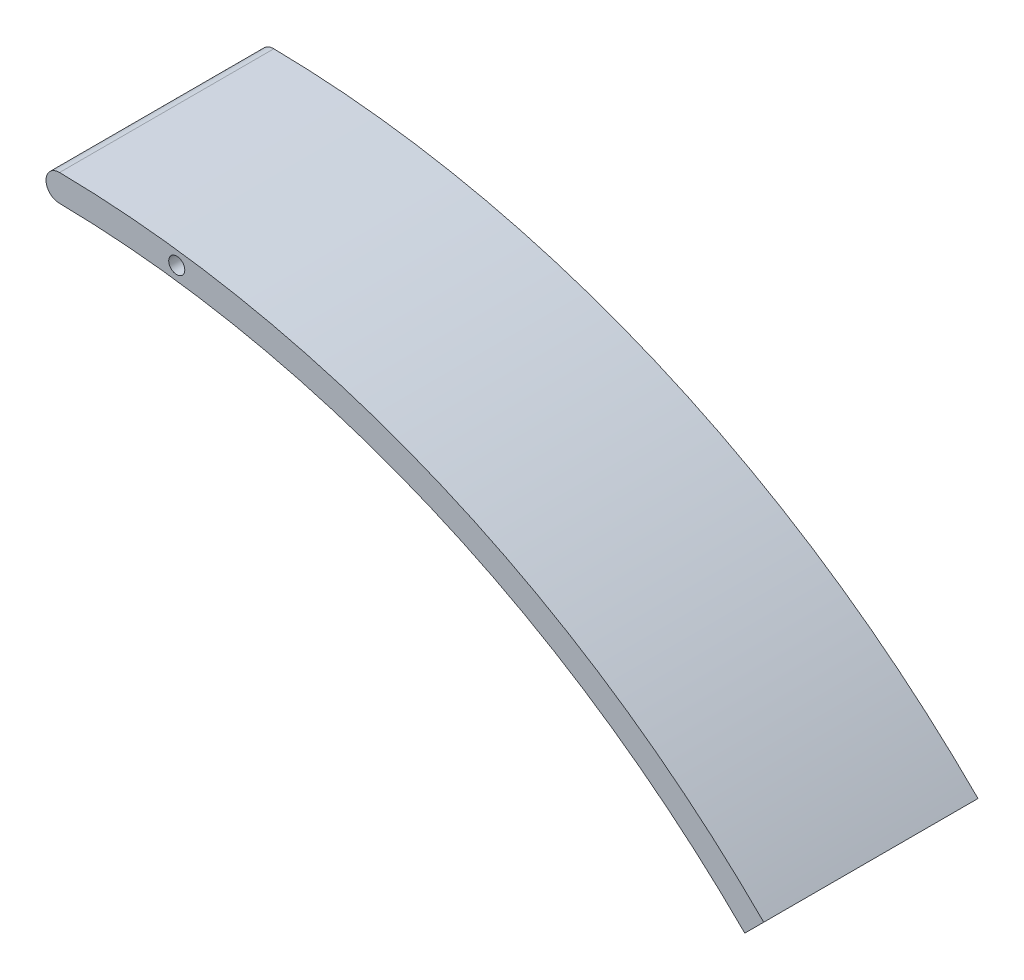
ISO-10303-21;
HEADER;
FILE_DESCRIPTION(('STEP AP214'),'2;1');
FILE_NAME('part.step','',(''),(''),'','','');
FILE_SCHEMA(('AUTOMOTIVE_DESIGN { 1 0 10303 214 1 1 1 1 }'));
ENDSEC;
DATA;
#1=APPLICATION_CONTEXT('core data for automotive mechanical design processes');
#2=APPLICATION_PROTOCOL_DEFINITION('international standard','automotive_design',2000,#1);
#3=PRODUCT_CONTEXT('',#1,'mechanical');
#4=PRODUCT('Part','Part','',(#3));
#5=PRODUCT_RELATED_PRODUCT_CATEGORY('part','',(#4));
#6=PRODUCT_DEFINITION_FORMATION('','',#4);
#7=PRODUCT_DEFINITION_CONTEXT('part definition',#1,'design');
#8=PRODUCT_DEFINITION('design','',#6,#7);
#9=PRODUCT_DEFINITION_SHAPE('','',#8);
#10=(LENGTH_UNIT() NAMED_UNIT(*) SI_UNIT(.MILLI.,.METRE.));
#11=(NAMED_UNIT(*) PLANE_ANGLE_UNIT() SI_UNIT($,.RADIAN.));
#12=(NAMED_UNIT(*) SI_UNIT($,.STERADIAN.) SOLID_ANGLE_UNIT());
#13=UNCERTAINTY_MEASURE_WITH_UNIT(LENGTH_MEASURE(1.E-05),#10,'distance_accuracy_value','');
#14=(GEOMETRIC_REPRESENTATION_CONTEXT(3) GLOBAL_UNCERTAINTY_ASSIGNED_CONTEXT((#13)) GLOBAL_UNIT_ASSIGNED_CONTEXT((#10,
#11,#12)) REPRESENTATION_CONTEXT('',''));
#15=CARTESIAN_POINT('',(0.,0.,0.));
#16=DIRECTION('',(0.,0.,1.));
#17=DIRECTION('',(1.,0.,0.));
#18=AXIS2_PLACEMENT_3D('',#15,#16,#17);
#19=CARTESIAN_POINT('',(0.,0.,80.));
#20=DIRECTION('',(0.,0.,-1.));
#21=DIRECTION('',(-1.,0.,0.));
#22=AXIS2_PLACEMENT_3D('',#19,#20,#21);
#23=CYLINDRICAL_SURFACE('',#22,379.);
#24=CARTESIAN_POINT('',(0.,0.,0.));
#25=DIRECTION('',(0.,0.,1.));
#26=DIRECTION('',(1.,0.,0.));
#27=AXIS2_PLACEMENT_3D('',#24,#25,#26);
#28=CIRCLE('',#27,379.);
#29=CARTESIAN_POINT('',(5.0668449197861,378.96612920228,0.));
#30=VERTEX_POINT('',#29);
#31=CARTESIAN_POINT('',(267.993470069702,267.993470069701,0.));
#32=VERTEX_POINT('',#31);
#33=EDGE_CURVE('E190',#30,#32,#28,.F.);
#34=ORIENTED_EDGE('',*,*,#33,.F.);
#35=DIRECTION('',(0.,0.,-1.));
#36=VECTOR('',#35,1.);
#37=CARTESIAN_POINT('',(5.0668449197861,378.96612920228,80.));
#38=LINE('',#37,#36);
#39=CARTESIAN_POINT('',(5.0668449197861,378.96612920228,80.));
#40=VERTEX_POINT('',#39);
#41=EDGE_CURVE('E11',#30,#40,#38,.F.);
#42=ORIENTED_EDGE('',*,*,#41,.T.);
#43=CARTESIAN_POINT('',(0.,0.,80.));
#44=DIRECTION('',(0.,0.,1.));
#45=DIRECTION('',(1.,0.,0.));
#46=AXIS2_PLACEMENT_3D('',#43,#44,#45);
#47=CIRCLE('',#46,379.);
#48=CARTESIAN_POINT('',(267.993470069702,267.993470069701,80.));
#49=VERTEX_POINT('',#48);
#50=EDGE_CURVE('E174',#40,#49,#47,.F.);
#51=ORIENTED_EDGE('',*,*,#50,.T.);
#52=DIRECTION('',(0.,0.,-1.));
#53=VECTOR('',#52,1.);
#54=CARTESIAN_POINT('',(267.993470069702,267.993470069701,80.));
#55=LINE('',#54,#53);
#56=EDGE_CURVE('E185',#49,#32,#55,.T.);
#57=ORIENTED_EDGE('',*,*,#56,.T.);
#58=EDGE_LOOP('',(#34,#42,#51,#57));
#59=FACE_BOUND('',#58,.T.);
#60=ADVANCED_FACE('F47',(#59),#23,.T.);
#61=CARTESIAN_POINT('',(0.,0.,80.));
#62=DIRECTION('',(0.,0.,-1.));
#63=DIRECTION('',(-1.,0.,0.));
#64=AXIS2_PLACEMENT_3D('',#61,#62,#63);
#65=CYLINDRICAL_SURFACE('',#64,369.);
#66=CARTESIAN_POINT('',(0.,0.,80.));
#67=DIRECTION('',(0.,0.,1.));
#68=DIRECTION('',(1.,0.,0.));
#69=AXIS2_PLACEMENT_3D('',#66,#67,#68);
#70=CIRCLE('',#69,369.);
#71=CARTESIAN_POINT('',(4.9331550802139,368.967022890874,80.));
#72=VERTEX_POINT('',#71);
#73=CARTESIAN_POINT('',(260.922402257837,260.922402257836,80.));
#74=VERTEX_POINT('',#73);
#75=EDGE_CURVE('E178',#72,#74,#70,.F.);
#76=ORIENTED_EDGE('',*,*,#75,.F.);
#77=DIRECTION('',(0.,0.,-1.));
#78=VECTOR('',#77,1.);
#79=CARTESIAN_POINT('',(4.9331550802139,368.967022890874,80.));
#80=LINE('',#79,#78);
#81=CARTESIAN_POINT('',(4.9331550802139,368.967022890874,0.));
#82=VERTEX_POINT('',#81);
#83=EDGE_CURVE('E208',#72,#82,#80,.T.);
#84=ORIENTED_EDGE('',*,*,#83,.T.);
#85=CARTESIAN_POINT('',(0.,0.,0.));
#86=DIRECTION('',(0.,0.,1.));
#87=DIRECTION('',(1.,0.,0.));
#88=AXIS2_PLACEMENT_3D('',#85,#86,#87);
#89=CIRCLE('',#88,369.);
#90=CARTESIAN_POINT('',(260.922402257837,260.922402257836,0.));
#91=VERTEX_POINT('',#90);
#92=EDGE_CURVE('E193',#82,#91,#89,.F.);
#93=ORIENTED_EDGE('',*,*,#92,.T.);
#94=DIRECTION('',(0.,0.,-1.));
#95=VECTOR('',#94,1.);
#96=CARTESIAN_POINT('',(260.922402257837,260.922402257836,80.));
#97=LINE('',#96,#95);
#98=CARTESIAN_POINT('',(260.922402257837,260.922402257835,20.));
#99=VERTEX_POINT('',#98);
#100=EDGE_CURVE('E203',#99,#91,#97,.T.);
#101=ORIENTED_EDGE('',*,*,#100,.F.);
#102=DIRECTION('',(0.,0.,-1.));
#103=VECTOR('',#102,1.);
#104=CARTESIAN_POINT('',(260.922402257837,260.922402257835,60.));
#105=LINE('',#104,#103);
#106=CARTESIAN_POINT('',(260.922402257837,260.922402257836,60.));
#107=VERTEX_POINT('',#106);
#108=EDGE_CURVE('E156',#107,#99,#105,.T.);
#109=ORIENTED_EDGE('',*,*,#108,.F.);
#110=EDGE_CURVE('E204',#74,#107,#97,.T.);
#111=ORIENTED_EDGE('',*,*,#110,.F.);
#112=EDGE_LOOP('',(#76,#84,#93,#101,#109,#111));
#113=FACE_BOUND('',#112,.T.);
#114=ADVANCED_FACE('F230',(#113),#65,.F.);
#115=CARTESIAN_POINT('',(48.8167958902993,370.800378153805,80.));
#116=DIRECTION('',(0.,0.,-1.));
#117=DIRECTION('',(-1.,0.,0.));
#118=AXIS2_PLACEMENT_3D('',#115,#116,#117);
#119=CYLINDRICAL_SURFACE('',#118,3.);
#120=CARTESIAN_POINT('',(48.8167958902993,370.800378153805,80.));
#121=DIRECTION('',(0.,0.,1.));
#122=DIRECTION('',(1.,0.,0.));
#123=AXIS2_PLACEMENT_3D('',#120,#121,#122);
#124=CIRCLE('',#123,3.);
#125=CARTESIAN_POINT('',(51.8167958902993,370.800378153805,80.));
#126=VERTEX_POINT('',#125);
#127=EDGE_CURVE('E170',#126,#126,#124,.T.);
#128=ORIENTED_EDGE('',*,*,#127,.T.);
#129=EDGE_LOOP('',(#128));
#130=FACE_BOUND('',#129,.T.);
#131=CARTESIAN_POINT('',(48.8167958902993,370.800378153805,0.));
#132=DIRECTION('',(0.,0.,1.));
#133=DIRECTION('',(1.,0.,0.));
#134=AXIS2_PLACEMENT_3D('',#131,#132,#133);
#135=CIRCLE('',#134,3.);
#136=CARTESIAN_POINT('',(51.8167958902993,370.800378153805,0.));
#137=VERTEX_POINT('',#136);
#138=EDGE_CURVE('E186',#137,#137,#135,.T.);
#139=ORIENTED_EDGE('',*,*,#138,.F.);
#140=EDGE_LOOP('',(#139));
#141=FACE_BOUND('',#140,.T.);
#142=ADVANCED_FACE('F267',(#130,#141),#119,.F.);
#143=CARTESIAN_POINT('',(-6.28036983473508E-13,6.28036983473513E-13,80.));
#144=DIRECTION('',(0.707106781186545,-0.70710678118655,0.));
#145=DIRECTION('',(0.70710678118655,0.707106781186545,0.));
#146=AXIS2_PLACEMENT_3D('',#143,#144,#145);
#147=PLANE('',#146);
#148=DIRECTION('',(-0.707106781186554,-0.707106781186541,0.));
#149=VECTOR('',#148,1.);
#150=CARTESIAN_POINT('',(260.922402257837,260.922402257835,60.));
#151=LINE('',#150,#149);
#152=CARTESIAN_POINT('',(263.750829382583,263.750829382581,60.));
#153=VERTEX_POINT('',#152);
#154=EDGE_CURVE('E64',#153,#107,#151,.T.);
#155=ORIENTED_EDGE('',*,*,#154,.F.);
#156=DIRECTION('',(0.,0.,1.));
#157=VECTOR('',#156,1.);
#158=CARTESIAN_POINT('',(263.750829382583,263.750829382581,60.));
#159=LINE('',#158,#157);
#160=CARTESIAN_POINT('',(263.750829382583,263.750829382581,20.));
#161=VERTEX_POINT('',#160);
#162=EDGE_CURVE('E143',#161,#153,#159,.T.);
#163=ORIENTED_EDGE('',*,*,#162,.F.);
#164=DIRECTION('',(0.707106781186554,0.707106781186541,0.));
#165=VECTOR('',#164,1.);
#166=CARTESIAN_POINT('',(260.922402257837,260.922402257835,20.));
#167=LINE('',#166,#165);
#168=EDGE_CURVE('E147',#99,#161,#167,.T.);
#169=ORIENTED_EDGE('',*,*,#168,.F.);
#170=ORIENTED_EDGE('',*,*,#100,.T.);
#171=DIRECTION('',(-0.70710678118655,-0.707106781186545,0.));
#172=VECTOR('',#171,1.);
#173=CARTESIAN_POINT('',(-6.28036983473508E-13,6.28036983473513E-13,0.));
#174=LINE('',#173,#172);
#175=EDGE_CURVE('E175',#32,#91,#174,.T.);
#176=ORIENTED_EDGE('',*,*,#175,.F.);
#177=ORIENTED_EDGE('',*,*,#56,.F.);
#178=DIRECTION('',(-0.70710678118655,-0.707106781186545,0.));
#179=VECTOR('',#178,1.);
#180=CARTESIAN_POINT('',(-6.28036983473508E-13,6.28036983473513E-13,80.));
#181=LINE('',#180,#179);
#182=EDGE_CURVE('E181',#49,#74,#181,.T.);
#183=ORIENTED_EDGE('',*,*,#182,.T.);
#184=ORIENTED_EDGE('',*,*,#110,.T.);
#185=EDGE_LOOP('',(#155,#163,#169,#170,#176,#177,#183,#184));
#186=FACE_BOUND('',#185,.T.);
#187=ADVANCED_FACE('F242',(#186),#147,.T.);
#188=CARTESIAN_POINT('',(0.,0.,80.));
#189=DIRECTION('',(0.,0.,1.));
#190=DIRECTION('',(1.,0.,0.));
#191=AXIS2_PLACEMENT_3D('',#188,#189,#190);
#192=PLANE('',#191);
#193=ORIENTED_EDGE('',*,*,#127,.F.);
#194=EDGE_LOOP('',(#193));
#195=FACE_BOUND('',#194,.T.);
#196=CARTESIAN_POINT('',(5.,373.966576046577,80.));
#197=DIRECTION('',(0.,0.,1.));
#198=DIRECTION('',(1.,0.,0.));
#199=AXIS2_PLACEMENT_3D('',#196,#197,#198);
#200=CIRCLE('',#199,5.);
#201=CARTESIAN_POINT('',(0.,373.966576046577,80.));
#202=VERTEX_POINT('',#201);
#203=EDGE_CURVE('E72',#40,#202,#200,.T.);
#204=ORIENTED_EDGE('',*,*,#203,.T.);
#205=CARTESIAN_POINT('',(5.,373.966576046577,80.));
#206=DIRECTION('',(0.,0.,1.));
#207=DIRECTION('',(1.,0.,0.));
#208=AXIS2_PLACEMENT_3D('',#205,#206,#207);
#209=CIRCLE('',#208,5.);
#210=EDGE_CURVE('E57',#202,#72,#209,.T.);
#211=ORIENTED_EDGE('',*,*,#210,.T.);
#212=ORIENTED_EDGE('',*,*,#75,.T.);
#213=ORIENTED_EDGE('',*,*,#182,.F.);
#214=ORIENTED_EDGE('',*,*,#50,.F.);
#215=EDGE_LOOP('',(#204,#211,#212,#213,#214));
#216=FACE_BOUND('',#215,.T.);
#217=ADVANCED_FACE('F223',(#195,#216),#192,.T.);
#218=CARTESIAN_POINT('',(0.,0.,0.));
#219=DIRECTION('',(0.,0.,1.));
#220=DIRECTION('',(1.,0.,0.));
#221=AXIS2_PLACEMENT_3D('',#218,#219,#220);
#222=PLANE('',#221);
#223=ORIENTED_EDGE('',*,*,#138,.T.);
#224=EDGE_LOOP('',(#223));
#225=FACE_BOUND('',#224,.T.);
#226=ORIENTED_EDGE('',*,*,#92,.F.);
#227=CARTESIAN_POINT('',(5.,373.966576046577,0.));
#228=DIRECTION('',(0.,0.,1.));
#229=DIRECTION('',(1.,0.,0.));
#230=AXIS2_PLACEMENT_3D('',#227,#228,#229);
#231=CIRCLE('',#230,5.);
#232=CARTESIAN_POINT('',(0.,373.966576046577,0.));
#233=VERTEX_POINT('',#232);
#234=EDGE_CURVE('E215',#82,#233,#231,.F.);
#235=ORIENTED_EDGE('',*,*,#234,.T.);
#236=CARTESIAN_POINT('',(5.,373.966576046577,0.));
#237=DIRECTION('',(0.,0.,1.));
#238=DIRECTION('',(1.,0.,0.));
#239=AXIS2_PLACEMENT_3D('',#236,#237,#238);
#240=CIRCLE('',#239,5.);
#241=EDGE_CURVE('E212',#233,#30,#240,.F.);
#242=ORIENTED_EDGE('',*,*,#241,.T.);
#243=ORIENTED_EDGE('',*,*,#33,.T.);
#244=ORIENTED_EDGE('',*,*,#175,.T.);
#245=EDGE_LOOP('',(#226,#235,#242,#243,#244));
#246=FACE_BOUND('',#245,.T.);
#247=ADVANCED_FACE('F235',(#225,#246),#222,.F.);
#248=CARTESIAN_POINT('',(5.,373.966576046577,80.));
#249=DIRECTION('',(0.,0.,-1.));
#250=DIRECTION('',(-1.,0.,0.));
#251=AXIS2_PLACEMENT_3D('',#248,#249,#250);
#252=CYLINDRICAL_SURFACE('',#251,5.);
#253=DIRECTION('',(0.,0.,1.));
#254=VECTOR('',#253,1.);
#255=CARTESIAN_POINT('',(0.,373.966576046577,0.));
#256=LINE('',#255,#254);
#257=EDGE_CURVE('E51',#202,#233,#256,.F.);
#258=ORIENTED_EDGE('',*,*,#257,.F.);
#259=ORIENTED_EDGE('',*,*,#203,.F.);
#260=ORIENTED_EDGE('',*,*,#41,.F.);
#261=ORIENTED_EDGE('',*,*,#241,.F.);
#262=EDGE_LOOP('',(#258,#259,#260,#261));
#263=FACE_BOUND('',#262,.T.);
#264=ADVANCED_FACE('F49',(#263),#252,.T.);
#265=CARTESIAN_POINT('',(5.,373.966576046577,80.));
#266=DIRECTION('',(0.,0.,-1.));
#267=DIRECTION('',(-1.,0.,0.));
#268=AXIS2_PLACEMENT_3D('',#265,#266,#267);
#269=CYLINDRICAL_SURFACE('',#268,5.);
#270=ORIENTED_EDGE('',*,*,#210,.F.);
#271=ORIENTED_EDGE('',*,*,#257,.T.);
#272=ORIENTED_EDGE('',*,*,#234,.F.);
#273=ORIENTED_EDGE('',*,*,#83,.F.);
#274=EDGE_LOOP('',(#270,#271,#272,#273));
#275=FACE_BOUND('',#274,.T.);
#276=ADVANCED_FACE('F232',(#275),#269,.T.);
#277=CARTESIAN_POINT('',(253.851334445972,267.9934700697,60.));
#278=DIRECTION('',(0.,0.,1.));
#279=DIRECTION('',(1.,0.,0.));
#280=AXIS2_PLACEMENT_3D('',#277,#278,#279);
#281=PLANE('',#280);
#282=ORIENTED_EDGE('',*,*,#154,.T.);
#283=DIRECTION('',(0.707106781186545,-0.70710678118655,0.));
#284=VECTOR('',#283,1.);
#285=CARTESIAN_POINT('',(253.851334445972,267.9934700697,60.));
#286=LINE('',#285,#284);
#287=CARTESIAN_POINT('',(253.851334445972,267.9934700697,60.));
#288=VERTEX_POINT('',#287);
#289=EDGE_CURVE('E118',#288,#107,#286,.T.);
#290=ORIENTED_EDGE('',*,*,#289,.F.);
#291=DIRECTION('',(-0.707106781186554,-0.707106781186541,0.));
#292=VECTOR('',#291,1.);
#293=CARTESIAN_POINT('',(253.851334445972,267.9934700697,60.));
#294=LINE('',#293,#292);
#295=CARTESIAN_POINT('',(256.679761570718,270.821897194447,60.));
#296=VERTEX_POINT('',#295);
#297=EDGE_CURVE('E122',#296,#288,#294,.T.);
#298=ORIENTED_EDGE('',*,*,#297,.F.);
#299=DIRECTION('',(0.707106781186545,-0.70710678118655,0.));
#300=VECTOR('',#299,1.);
#301=CARTESIAN_POINT('',(256.679761570718,270.821897194447,60.));
#302=LINE('',#301,#300);
#303=EDGE_CURVE('E162',#296,#153,#302,.T.);
#304=ORIENTED_EDGE('',*,*,#303,.T.);
#305=EDGE_LOOP('',(#282,#290,#298,#304));
#306=FACE_BOUND('',#305,.T.);
#307=ADVANCED_FACE('F120',(#306),#281,.F.);
#308=CARTESIAN_POINT('',(256.679761570718,270.821897194447,60.));
#309=DIRECTION('',(0.70710678118655,0.707106781186545,0.));
#310=DIRECTION('',(-0.707106781186545,0.70710678118655,0.));
#311=AXIS2_PLACEMENT_3D('',#308,#309,#310);
#312=PLANE('',#311);
#313=ORIENTED_EDGE('',*,*,#162,.T.);
#314=ORIENTED_EDGE('',*,*,#303,.F.);
#315=DIRECTION('',(0.,0.,1.));
#316=VECTOR('',#315,1.);
#317=CARTESIAN_POINT('',(256.679761570718,270.821897194447,60.));
#318=LINE('',#317,#316);
#319=CARTESIAN_POINT('',(256.679761570718,270.821897194447,20.));
#320=VERTEX_POINT('',#319);
#321=EDGE_CURVE('E129',#320,#296,#318,.T.);
#322=ORIENTED_EDGE('',*,*,#321,.F.);
#323=DIRECTION('',(0.707106781186545,-0.70710678118655,0.));
#324=VECTOR('',#323,1.);
#325=CARTESIAN_POINT('',(256.679761570718,270.821897194447,20.));
#326=LINE('',#325,#324);
#327=EDGE_CURVE('E165',#320,#161,#326,.T.);
#328=ORIENTED_EDGE('',*,*,#327,.T.);
#329=EDGE_LOOP('',(#313,#314,#322,#328));
#330=FACE_BOUND('',#329,.T.);
#331=ADVANCED_FACE('F252',(#330),#312,.F.);
#332=CARTESIAN_POINT('',(253.851334445972,267.9934700697,20.));
#333=DIRECTION('',(0.,0.,-1.));
#334=DIRECTION('',(-1.,0.,0.));
#335=AXIS2_PLACEMENT_3D('',#332,#333,#334);
#336=PLANE('',#335);
#337=ORIENTED_EDGE('',*,*,#168,.T.);
#338=ORIENTED_EDGE('',*,*,#327,.F.);
#339=DIRECTION('',(0.707106781186554,0.707106781186541,0.));
#340=VECTOR('',#339,1.);
#341=CARTESIAN_POINT('',(253.851334445972,267.9934700697,20.));
#342=LINE('',#341,#340);
#343=CARTESIAN_POINT('',(253.851334445972,267.9934700697,20.));
#344=VERTEX_POINT('',#343);
#345=EDGE_CURVE('E138',#344,#320,#342,.T.);
#346=ORIENTED_EDGE('',*,*,#345,.F.);
#347=DIRECTION('',(0.707106781186545,-0.70710678118655,0.));
#348=VECTOR('',#347,1.);
#349=CARTESIAN_POINT('',(253.851334445972,267.9934700697,20.));
#350=LINE('',#349,#348);
#351=EDGE_CURVE('E128',#344,#99,#350,.T.);
#352=ORIENTED_EDGE('',*,*,#351,.T.);
#353=EDGE_LOOP('',(#337,#338,#346,#352));
#354=FACE_BOUND('',#353,.T.);
#355=ADVANCED_FACE('F250',(#354),#336,.F.);
#356=CARTESIAN_POINT('',(253.851334445972,267.9934700697,60.));
#357=DIRECTION('',(-0.70710678118655,-0.707106781186545,0.));
#358=DIRECTION('',(0.707106781186545,-0.70710678118655,0.));
#359=AXIS2_PLACEMENT_3D('',#356,#357,#358);
#360=PLANE('',#359);
#361=ORIENTED_EDGE('',*,*,#108,.T.);
#362=ORIENTED_EDGE('',*,*,#351,.F.);
#363=DIRECTION('',(0.,0.,-1.));
#364=VECTOR('',#363,1.);
#365=CARTESIAN_POINT('',(253.851334445972,267.9934700697,60.));
#366=LINE('',#365,#364);
#367=EDGE_CURVE('E132',#288,#344,#366,.T.);
#368=ORIENTED_EDGE('',*,*,#367,.F.);
#369=ORIENTED_EDGE('',*,*,#289,.T.);
#370=EDGE_LOOP('',(#361,#362,#368,#369));
#371=FACE_BOUND('',#370,.T.);
#372=ADVANCED_FACE('F133',(#371),#360,.F.);
#373=CARTESIAN_POINT('',(-7.071067811867,7.07106781186705,0.));
#374=DIRECTION('',(-0.707106781186541,0.707106781186554,0.));
#375=DIRECTION('',(-0.707106781186554,-0.707106781186541,0.));
#376=AXIS2_PLACEMENT_3D('',#373,#374,#375);
#377=PLANE('',#376);
#378=ORIENTED_EDGE('',*,*,#297,.T.);
#379=ORIENTED_EDGE('',*,*,#367,.T.);
#380=ORIENTED_EDGE('',*,*,#345,.T.);
#381=ORIENTED_EDGE('',*,*,#321,.T.);
#382=EDGE_LOOP('',(#378,#379,#380,#381));
#383=FACE_BOUND('',#382,.T.);
#384=ADVANCED_FACE('F140',(#383),#377,.F.);
#385=CLOSED_SHELL('',(#60,#114,#142,#187,#217,#247,#264,#276,#307,#331,#355,#372,#384));
#386=MANIFOLD_SOLID_BREP('B2',#385);
#387=ADVANCED_BREP_SHAPE_REPRESENTATION('',(#18,#386),#14);
#388=SHAPE_DEFINITION_REPRESENTATION(#9,#387);
ENDSEC;
END-ISO-10303-21;
